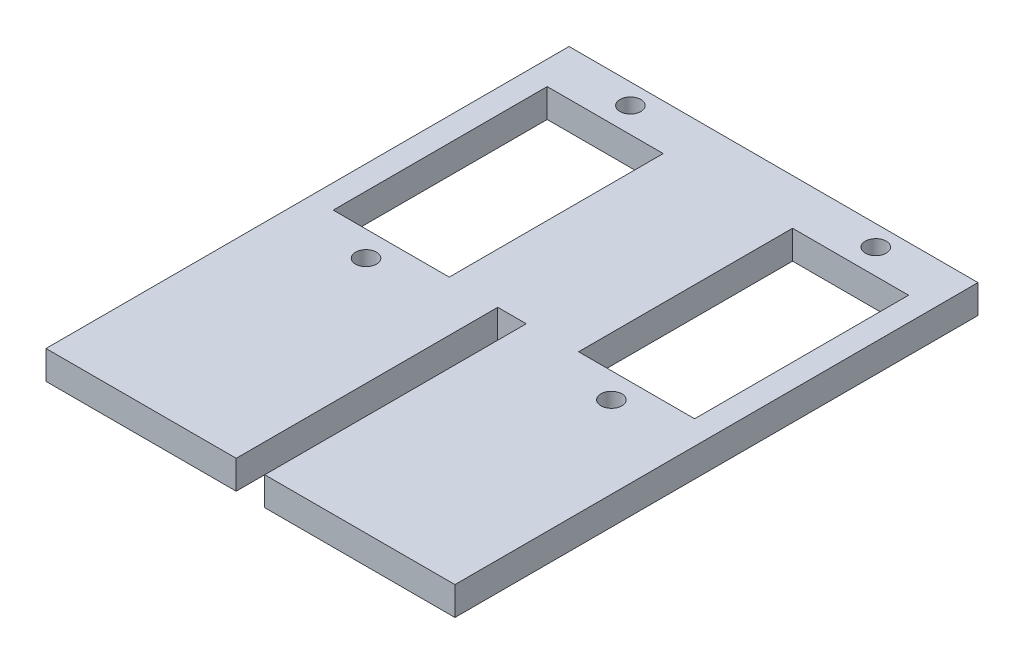
ISO-10303-21;
HEADER;
FILE_DESCRIPTION(('STEP AP214'),'2;1');
FILE_NAME('part.step','',(''),(''),'','','');
FILE_SCHEMA(('AUTOMOTIVE_DESIGN { 1 0 10303 214 1 1 1 1 }'));
ENDSEC;
DATA;
#1=APPLICATION_CONTEXT('core data for automotive mechanical design processes');
#2=APPLICATION_PROTOCOL_DEFINITION('international standard','automotive_design',2000,#1);
#3=PRODUCT_CONTEXT('',#1,'mechanical');
#4=PRODUCT('Part','Part','',(#3));
#5=PRODUCT_RELATED_PRODUCT_CATEGORY('part','',(#4));
#6=PRODUCT_DEFINITION_FORMATION('','',#4);
#7=PRODUCT_DEFINITION_CONTEXT('part definition',#1,'design');
#8=PRODUCT_DEFINITION('design','',#6,#7);
#9=PRODUCT_DEFINITION_SHAPE('','',#8);
#10=(LENGTH_UNIT() NAMED_UNIT(*) SI_UNIT(.MILLI.,.METRE.));
#11=(NAMED_UNIT(*) PLANE_ANGLE_UNIT() SI_UNIT($,.RADIAN.));
#12=(NAMED_UNIT(*) SI_UNIT($,.STERADIAN.) SOLID_ANGLE_UNIT());
#13=UNCERTAINTY_MEASURE_WITH_UNIT(LENGTH_MEASURE(1.E-05),#10,'distance_accuracy_value','');
#14=(GEOMETRIC_REPRESENTATION_CONTEXT(3) GLOBAL_UNCERTAINTY_ASSIGNED_CONTEXT((#13)) GLOBAL_UNIT_ASSIGNED_CONTEXT((#10,
#11,#12)) REPRESENTATION_CONTEXT('',''));
#15=CARTESIAN_POINT('',(0.,0.,0.));
#16=DIRECTION('',(0.,0.,1.));
#17=DIRECTION('',(1.,0.,0.));
#18=AXIS2_PLACEMENT_3D('',#15,#16,#17);
#19=CARTESIAN_POINT('',(-21.5,3.,27.5));
#20=DIRECTION('',(0.,0.,-1.));
#21=DIRECTION('',(-1.,0.,0.));
#22=AXIS2_PLACEMENT_3D('',#19,#20,#21);
#23=PLANE('',#22);
#24=DIRECTION('',(1.,0.,0.));
#25=VECTOR('',#24,1.);
#26=CARTESIAN_POINT('',(-21.5,0.,27.5));
#27=LINE('',#26,#25);
#28=CARTESIAN_POINT('',(-21.5,0.,27.5));
#29=VERTEX_POINT('',#28);
#30=CARTESIAN_POINT('',(-1.5,0.,27.5));
#31=VERTEX_POINT('',#30);
#32=EDGE_CURVE('E253',#29,#31,#27,.T.);
#33=ORIENTED_EDGE('',*,*,#32,.T.);
#34=DIRECTION('',(0.,1.,0.));
#35=VECTOR('',#34,1.);
#36=CARTESIAN_POINT('',(-1.5,-7.,27.5));
#37=LINE('',#36,#35);
#38=CARTESIAN_POINT('',(-1.5,3.,27.5));
#39=VERTEX_POINT('',#38);
#40=EDGE_CURVE('E239',#31,#39,#37,.T.);
#41=ORIENTED_EDGE('',*,*,#40,.T.);
#42=DIRECTION('',(1.,0.,0.));
#43=VECTOR('',#42,1.);
#44=CARTESIAN_POINT('',(-21.5,3.,27.5));
#45=LINE('',#44,#43);
#46=CARTESIAN_POINT('',(-21.5,3.,27.5));
#47=VERTEX_POINT('',#46);
#48=EDGE_CURVE('E258',#47,#39,#45,.T.);
#49=ORIENTED_EDGE('',*,*,#48,.F.);
#50=DIRECTION('',(0.,-1.,0.));
#51=VECTOR('',#50,1.);
#52=CARTESIAN_POINT('',(-21.5,3.,27.5));
#53=LINE('',#52,#51);
#54=EDGE_CURVE('E273',#47,#29,#53,.T.);
#55=ORIENTED_EDGE('',*,*,#54,.T.);
#56=EDGE_LOOP('',(#33,#41,#49,#55));
#57=FACE_BOUND('',#56,.T.);
#58=ADVANCED_FACE('F33',(#57),#23,.F.);
#59=CARTESIAN_POINT('',(21.5,3.,27.5));
#60=DIRECTION('',(-1.,0.,0.));
#61=DIRECTION('',(0.,0.,1.));
#62=AXIS2_PLACEMENT_3D('',#59,#60,#61);
#63=PLANE('',#62);
#64=DIRECTION('',(0.,0.,-1.));
#65=VECTOR('',#64,1.);
#66=CARTESIAN_POINT('',(21.5,0.,27.5));
#67=LINE('',#66,#65);
#68=CARTESIAN_POINT('',(21.5,0.,27.5));
#69=VERTEX_POINT('',#68);
#70=CARTESIAN_POINT('',(21.5,0.,-27.5));
#71=VERTEX_POINT('',#70);
#72=EDGE_CURVE('E242',#69,#71,#67,.T.);
#73=ORIENTED_EDGE('',*,*,#72,.T.);
#74=DIRECTION('',(0.,-1.,0.));
#75=VECTOR('',#74,1.);
#76=CARTESIAN_POINT('',(21.5,3.,-27.5));
#77=LINE('',#76,#75);
#78=CARTESIAN_POINT('',(21.5,3.,-27.5));
#79=VERTEX_POINT('',#78);
#80=EDGE_CURVE('E279',#79,#71,#77,.T.);
#81=ORIENTED_EDGE('',*,*,#80,.F.);
#82=DIRECTION('',(0.,0.,-1.));
#83=VECTOR('',#82,1.);
#84=CARTESIAN_POINT('',(21.5,3.,27.5));
#85=LINE('',#84,#83);
#86=CARTESIAN_POINT('',(21.5,3.,27.5));
#87=VERTEX_POINT('',#86);
#88=EDGE_CURVE('E249',#87,#79,#85,.T.);
#89=ORIENTED_EDGE('',*,*,#88,.F.);
#90=DIRECTION('',(0.,-1.,0.));
#91=VECTOR('',#90,1.);
#92=CARTESIAN_POINT('',(21.5,3.,27.5));
#93=LINE('',#92,#91);
#94=EDGE_CURVE('E261',#87,#69,#93,.T.);
#95=ORIENTED_EDGE('',*,*,#94,.T.);
#96=EDGE_LOOP('',(#73,#81,#89,#95));
#97=FACE_BOUND('',#96,.T.);
#98=ADVANCED_FACE('F35',(#97),#63,.F.);
#99=CARTESIAN_POINT('',(-21.5,3.,-27.5));
#100=DIRECTION('',(0.,0.,1.));
#101=DIRECTION('',(1.,0.,0.));
#102=AXIS2_PLACEMENT_3D('',#99,#100,#101);
#103=PLANE('',#102);
#104=DIRECTION('',(-1.,0.,0.));
#105=VECTOR('',#104,1.);
#106=CARTESIAN_POINT('',(-21.5,0.,-27.5));
#107=LINE('',#106,#105);
#108=CARTESIAN_POINT('',(-21.5,0.,-27.5));
#109=VERTEX_POINT('',#108);
#110=EDGE_CURVE('E264',#71,#109,#107,.T.);
#111=ORIENTED_EDGE('',*,*,#110,.T.);
#112=DIRECTION('',(0.,-1.,0.));
#113=VECTOR('',#112,1.);
#114=CARTESIAN_POINT('',(-21.5,3.,-27.5));
#115=LINE('',#114,#113);
#116=CARTESIAN_POINT('',(-21.5,3.,-27.5));
#117=VERTEX_POINT('',#116);
#118=EDGE_CURVE('E276',#117,#109,#115,.T.);
#119=ORIENTED_EDGE('',*,*,#118,.F.);
#120=DIRECTION('',(-1.,0.,0.));
#121=VECTOR('',#120,1.);
#122=CARTESIAN_POINT('',(-21.5,3.,-27.5));
#123=LINE('',#122,#121);
#124=EDGE_CURVE('E252',#79,#117,#123,.T.);
#125=ORIENTED_EDGE('',*,*,#124,.F.);
#126=ORIENTED_EDGE('',*,*,#80,.T.);
#127=EDGE_LOOP('',(#111,#119,#125,#126));
#128=FACE_BOUND('',#127,.T.);
#129=ADVANCED_FACE('F319',(#128),#103,.F.);
#130=CARTESIAN_POINT('',(-21.5,3.,27.5));
#131=DIRECTION('',(1.,0.,0.));
#132=DIRECTION('',(0.,0.,-1.));
#133=AXIS2_PLACEMENT_3D('',#130,#131,#132);
#134=PLANE('',#133);
#135=DIRECTION('',(0.,0.,1.));
#136=VECTOR('',#135,1.);
#137=CARTESIAN_POINT('',(-21.5,0.,27.5));
#138=LINE('',#137,#136);
#139=EDGE_CURVE('E266',#109,#29,#138,.T.);
#140=ORIENTED_EDGE('',*,*,#139,.T.);
#141=ORIENTED_EDGE('',*,*,#54,.F.);
#142=DIRECTION('',(0.,0.,1.));
#143=VECTOR('',#142,1.);
#144=CARTESIAN_POINT('',(-21.5,3.,27.5));
#145=LINE('',#144,#143);
#146=EDGE_CURVE('E255',#117,#47,#145,.T.);
#147=ORIENTED_EDGE('',*,*,#146,.F.);
#148=ORIENTED_EDGE('',*,*,#118,.T.);
#149=EDGE_LOOP('',(#140,#141,#147,#148));
#150=FACE_BOUND('',#149,.T.);
#151=ADVANCED_FACE('F315',(#150),#134,.F.);
#152=CARTESIAN_POINT('',(1.5,3.,27.5));
#153=VERTEX_POINT('',#152);
#154=EDGE_CURVE('E257',#153,#87,#45,.T.);
#155=ORIENTED_EDGE('',*,*,#154,.F.);
#156=DIRECTION('',(0.,1.,0.));
#157=VECTOR('',#156,1.);
#158=CARTESIAN_POINT('',(1.5,-7.,27.5));
#159=LINE('',#158,#157);
#160=CARTESIAN_POINT('',(1.5,0.,27.5));
#161=VERTEX_POINT('',#160);
#162=EDGE_CURVE('E245',#161,#153,#159,.T.);
#163=ORIENTED_EDGE('',*,*,#162,.F.);
#164=EDGE_CURVE('E268',#161,#69,#27,.T.);
#165=ORIENTED_EDGE('',*,*,#164,.T.);
#166=ORIENTED_EDGE('',*,*,#94,.F.);
#167=EDGE_LOOP('',(#155,#163,#165,#166));
#168=FACE_BOUND('',#167,.T.);
#169=ADVANCED_FACE('F299',(#168),#23,.F.);
#170=CARTESIAN_POINT('',(0.,3.,0.));
#171=DIRECTION('',(0.,-1.,0.));
#172=DIRECTION('',(0.,0.,-1.));
#173=AXIS2_PLACEMENT_3D('',#170,#171,#172);
#174=PLANE('',#173);
#175=CARTESIAN_POINT('',(-12.8999999999996,3.,-25.3500000000002));
#176=DIRECTION('',(0.,-1.,0.));
#177=DIRECTION('',(0.,0.,-1.));
#178=AXIS2_PLACEMENT_3D('',#175,#176,#177);
#179=CIRCLE('',#178,1.1);
#180=CARTESIAN_POINT('',(-12.8999999999996,3.,-26.4500000000002));
#181=VERTEX_POINT('',#180);
#182=EDGE_CURVE('E228',#181,#181,#179,.T.);
#183=ORIENTED_EDGE('',*,*,#182,.T.);
#184=EDGE_LOOP('',(#183));
#185=FACE_BOUND('',#184,.T.);
#186=CARTESIAN_POINT('',(12.8999999999999,3.,2.44999999999984));
#187=DIRECTION('',(0.,-1.,0.));
#188=DIRECTION('',(0.,0.,-1.));
#189=AXIS2_PLACEMENT_3D('',#186,#187,#188);
#190=CIRCLE('',#189,1.1);
#191=CARTESIAN_POINT('',(12.8999999999999,3.,1.34999999999984));
#192=VERTEX_POINT('',#191);
#193=EDGE_CURVE('E225',#192,#192,#190,.T.);
#194=ORIENTED_EDGE('',*,*,#193,.T.);
#195=EDGE_LOOP('',(#194));
#196=FACE_BOUND('',#195,.T.);
#197=CARTESIAN_POINT('',(12.8999999999996,3.,-25.3500000000002));
#198=DIRECTION('',(0.,-1.,0.));
#199=DIRECTION('',(0.,0.,-1.));
#200=AXIS2_PLACEMENT_3D('',#197,#198,#199);
#201=CIRCLE('',#200,1.1);
#202=CARTESIAN_POINT('',(12.8999999999996,3.,-26.4500000000002));
#203=VERTEX_POINT('',#202);
#204=EDGE_CURVE('E222',#203,#203,#201,.T.);
#205=ORIENTED_EDGE('',*,*,#204,.T.);
#206=EDGE_LOOP('',(#205));
#207=FACE_BOUND('',#206,.T.);
#208=DIRECTION('',(1.,0.,0.));
#209=VECTOR('',#208,1.);
#210=CARTESIAN_POINT('',(0.,3.,-22.7000000000002));
#211=LINE('',#210,#209);
#212=CARTESIAN_POINT('',(-18.9999999999996,3.,-22.7000000000002));
#213=VERTEX_POINT('',#212);
#214=CARTESIAN_POINT('',(-6.79999999999987,3.,-22.7000000000002));
#215=VERTEX_POINT('',#214);
#216=EDGE_CURVE('E216',#213,#215,#211,.T.);
#217=ORIENTED_EDGE('',*,*,#216,.T.);
#218=DIRECTION('',(0.,0.,1.));
#219=VECTOR('',#218,1.);
#220=CARTESIAN_POINT('',(-6.79999999999987,3.,0.));
#221=LINE('',#220,#219);
#222=CARTESIAN_POINT('',(-6.79999999999987,3.,-0.200000000000102));
#223=VERTEX_POINT('',#222);
#224=EDGE_CURVE('E219',#215,#223,#221,.T.);
#225=ORIENTED_EDGE('',*,*,#224,.T.);
#226=DIRECTION('',(-1.,0.,0.));
#227=VECTOR('',#226,1.);
#228=CARTESIAN_POINT('',(0.,3.,-0.200000000000102));
#229=LINE('',#228,#227);
#230=CARTESIAN_POINT('',(-18.9999999999996,3.,-0.200000000000102));
#231=VERTEX_POINT('',#230);
#232=EDGE_CURVE('E213',#223,#231,#229,.T.);
#233=ORIENTED_EDGE('',*,*,#232,.T.);
#234=DIRECTION('',(0.,0.,-1.));
#235=VECTOR('',#234,1.);
#236=CARTESIAN_POINT('',(-18.9999999999996,3.,0.));
#237=LINE('',#236,#235);
#238=EDGE_CURVE('E150',#231,#213,#237,.T.);
#239=ORIENTED_EDGE('',*,*,#238,.T.);
#240=EDGE_LOOP('',(#217,#225,#233,#239));
#241=FACE_BOUND('',#240,.T.);
#242=CARTESIAN_POINT('',(-12.8999999999999,3.,2.44999999999984));
#243=DIRECTION('',(0.,-1.,0.));
#244=DIRECTION('',(0.,0.,-1.));
#245=AXIS2_PLACEMENT_3D('',#242,#243,#244);
#246=CIRCLE('',#245,1.1);
#247=CARTESIAN_POINT('',(-12.8999999999999,3.,1.34999999999984));
#248=VERTEX_POINT('',#247);
#249=EDGE_CURVE('E210',#248,#248,#246,.T.);
#250=ORIENTED_EDGE('',*,*,#249,.T.);
#251=EDGE_LOOP('',(#250));
#252=FACE_BOUND('',#251,.T.);
#253=DIRECTION('',(1.,0.,0.));
#254=VECTOR('',#253,1.);
#255=CARTESIAN_POINT('',(0.,3.,-22.7000000000002));
#256=LINE('',#255,#254);
#257=CARTESIAN_POINT('',(6.79999999999987,3.,-22.7000000000002));
#258=VERTEX_POINT('',#257);
#259=CARTESIAN_POINT('',(18.9999999999996,3.,-22.7000000000002));
#260=VERTEX_POINT('',#259);
#261=EDGE_CURVE('E204',#258,#260,#256,.T.);
#262=ORIENTED_EDGE('',*,*,#261,.T.);
#263=DIRECTION('',(0.,0.,1.));
#264=VECTOR('',#263,1.);
#265=CARTESIAN_POINT('',(18.9999999999996,3.,0.));
#266=LINE('',#265,#264);
#267=CARTESIAN_POINT('',(18.9999999999996,3.,-0.200000000000102));
#268=VERTEX_POINT('',#267);
#269=EDGE_CURVE('E207',#260,#268,#266,.T.);
#270=ORIENTED_EDGE('',*,*,#269,.T.);
#271=DIRECTION('',(-1.,0.,0.));
#272=VECTOR('',#271,1.);
#273=CARTESIAN_POINT('',(0.,3.,-0.200000000000102));
#274=LINE('',#273,#272);
#275=CARTESIAN_POINT('',(6.79999999999987,3.,-0.200000000000102));
#276=VERTEX_POINT('',#275);
#277=EDGE_CURVE('E193',#268,#276,#274,.T.);
#278=ORIENTED_EDGE('',*,*,#277,.T.);
#279=DIRECTION('',(0.,0.,-1.));
#280=VECTOR('',#279,1.);
#281=CARTESIAN_POINT('',(6.79999999999987,3.,0.));
#282=LINE('',#281,#280);
#283=EDGE_CURVE('E201',#276,#258,#282,.T.);
#284=ORIENTED_EDGE('',*,*,#283,.T.);
#285=EDGE_LOOP('',(#262,#270,#278,#284));
#286=FACE_BOUND('',#285,.T.);
#287=ORIENTED_EDGE('',*,*,#48,.T.);
#288=DIRECTION('',(0.,0.,1.));
#289=VECTOR('',#288,1.);
#290=CARTESIAN_POINT('',(-1.5,3.,27.5));
#291=LINE('',#290,#289);
#292=CARTESIAN_POINT('',(-1.5,3.,0.));
#293=VERTEX_POINT('',#292);
#294=EDGE_CURVE('E231',#293,#39,#291,.T.);
#295=ORIENTED_EDGE('',*,*,#294,.F.);
#296=DIRECTION('',(-1.,0.,0.));
#297=VECTOR('',#296,1.);
#298=CARTESIAN_POINT('',(-1.5,3.,0.));
#299=LINE('',#298,#297);
#300=CARTESIAN_POINT('',(1.5,3.,0.));
#301=VERTEX_POINT('',#300);
#302=EDGE_CURVE('E236',#301,#293,#299,.T.);
#303=ORIENTED_EDGE('',*,*,#302,.F.);
#304=DIRECTION('',(0.,0.,-1.));
#305=VECTOR('',#304,1.);
#306=CARTESIAN_POINT('',(1.5,3.,27.5));
#307=LINE('',#306,#305);
#308=EDGE_CURVE('E233',#153,#301,#307,.T.);
#309=ORIENTED_EDGE('',*,*,#308,.F.);
#310=ORIENTED_EDGE('',*,*,#154,.T.);
#311=ORIENTED_EDGE('',*,*,#88,.T.);
#312=ORIENTED_EDGE('',*,*,#124,.T.);
#313=ORIENTED_EDGE('',*,*,#146,.T.);
#314=EDGE_LOOP('',(#287,#295,#303,#309,#310,#311,#312,#313));
#315=FACE_BOUND('',#314,.T.);
#316=ADVANCED_FACE('F303',(#185,#196,#207,#241,#252,#286,#315),#174,.F.);
#317=CARTESIAN_POINT('',(0.,0.,0.));
#318=DIRECTION('',(0.,-1.,0.));
#319=DIRECTION('',(0.,0.,-1.));
#320=AXIS2_PLACEMENT_3D('',#317,#318,#319);
#321=PLANE('',#320);
#322=CARTESIAN_POINT('',(-12.8999999999996,0.,-25.3500000000002));
#323=DIRECTION('',(0.,-1.,0.));
#324=DIRECTION('',(0.,0.,1.));
#325=AXIS2_PLACEMENT_3D('',#322,#323,#324);
#326=CIRCLE('',#325,1.1);
#327=CARTESIAN_POINT('',(-12.8999999999996,0.,-24.2500000000002));
#328=VERTEX_POINT('',#327);
#329=EDGE_CURVE('E516',#328,#328,#326,.T.);
#330=ORIENTED_EDGE('',*,*,#329,.F.);
#331=EDGE_LOOP('',(#330));
#332=FACE_BOUND('',#331,.T.);
#333=CARTESIAN_POINT('',(12.8999999999999,0.,2.44999999999984));
#334=DIRECTION('',(0.,-1.,0.));
#335=DIRECTION('',(0.,0.,-1.));
#336=AXIS2_PLACEMENT_3D('',#333,#334,#335);
#337=CIRCLE('',#336,1.1);
#338=CARTESIAN_POINT('',(12.8999999999999,0.,1.34999999999984));
#339=VERTEX_POINT('',#338);
#340=EDGE_CURVE('E180',#339,#339,#337,.T.);
#341=ORIENTED_EDGE('',*,*,#340,.F.);
#342=EDGE_LOOP('',(#341));
#343=FACE_BOUND('',#342,.T.);
#344=CARTESIAN_POINT('',(12.8999999999996,0.,-25.3500000000002));
#345=DIRECTION('',(0.,-1.,0.));
#346=DIRECTION('',(0.,0.,-1.));
#347=AXIS2_PLACEMENT_3D('',#344,#345,#346);
#348=CIRCLE('',#347,1.1);
#349=CARTESIAN_POINT('',(12.8999999999996,0.,-26.4500000000002));
#350=VERTEX_POINT('',#349);
#351=EDGE_CURVE('E177',#350,#350,#348,.T.);
#352=ORIENTED_EDGE('',*,*,#351,.F.);
#353=EDGE_LOOP('',(#352));
#354=FACE_BOUND('',#353,.T.);
#355=DIRECTION('',(0.,0.,1.));
#356=VECTOR('',#355,1.);
#357=CARTESIAN_POINT('',(-6.79999999999987,0.,-0.200000000000102));
#358=LINE('',#357,#356);
#359=CARTESIAN_POINT('',(-6.79999999999987,0.,-22.7000000000002));
#360=VERTEX_POINT('',#359);
#361=CARTESIAN_POINT('',(-6.79999999999987,0.,-0.200000000000102));
#362=VERTEX_POINT('',#361);
#363=EDGE_CURVE('E162',#360,#362,#358,.T.);
#364=ORIENTED_EDGE('',*,*,#363,.F.);
#365=DIRECTION('',(1.,0.,0.));
#366=VECTOR('',#365,1.);
#367=CARTESIAN_POINT('',(-6.79999999999987,0.,-22.7000000000002));
#368=LINE('',#367,#366);
#369=CARTESIAN_POINT('',(-18.9999999999996,0.,-22.7000000000002));
#370=VERTEX_POINT('',#369);
#371=EDGE_CURVE('E167',#370,#360,#368,.T.);
#372=ORIENTED_EDGE('',*,*,#371,.F.);
#373=DIRECTION('',(0.,0.,-1.));
#374=VECTOR('',#373,1.);
#375=CARTESIAN_POINT('',(-18.9999999999996,0.,-0.200000000000102));
#376=LINE('',#375,#374);
#377=CARTESIAN_POINT('',(-18.9999999999996,0.,-0.200000000000102));
#378=VERTEX_POINT('',#377);
#379=EDGE_CURVE('E147',#378,#370,#376,.T.);
#380=ORIENTED_EDGE('',*,*,#379,.F.);
#381=DIRECTION('',(-1.,0.,0.));
#382=VECTOR('',#381,1.);
#383=CARTESIAN_POINT('',(-6.79999999999987,0.,-0.200000000000102));
#384=LINE('',#383,#382);
#385=EDGE_CURVE('E157',#362,#378,#384,.T.);
#386=ORIENTED_EDGE('',*,*,#385,.F.);
#387=EDGE_LOOP('',(#364,#372,#380,#386));
#388=FACE_BOUND('',#387,.T.);
#389=CARTESIAN_POINT('',(-12.8999999999999,0.,2.44999999999984));
#390=DIRECTION('',(0.,-1.,0.));
#391=DIRECTION('',(0.,0.,1.));
#392=AXIS2_PLACEMENT_3D('',#389,#390,#391);
#393=CIRCLE('',#392,1.1);
#394=CARTESIAN_POINT('',(-12.8999999999999,0.,3.54999999999984));
#395=VERTEX_POINT('',#394);
#396=EDGE_CURVE('E538',#395,#395,#393,.T.);
#397=ORIENTED_EDGE('',*,*,#396,.F.);
#398=EDGE_LOOP('',(#397));
#399=FACE_BOUND('',#398,.T.);
#400=DIRECTION('',(0.,0.,1.));
#401=VECTOR('',#400,1.);
#402=CARTESIAN_POINT('',(18.9999999999996,0.,-0.200000000000102));
#403=LINE('',#402,#401);
#404=CARTESIAN_POINT('',(18.9999999999996,0.,-22.7000000000002));
#405=VERTEX_POINT('',#404);
#406=CARTESIAN_POINT('',(18.9999999999996,0.,-0.200000000000102));
#407=VERTEX_POINT('',#406);
#408=EDGE_CURVE('E174',#405,#407,#403,.T.);
#409=ORIENTED_EDGE('',*,*,#408,.F.);
#410=DIRECTION('',(1.,0.,0.));
#411=VECTOR('',#410,1.);
#412=CARTESIAN_POINT('',(6.79999999999987,0.,-22.7000000000002));
#413=LINE('',#412,#411);
#414=CARTESIAN_POINT('',(6.79999999999987,0.,-22.7000000000002));
#415=VERTEX_POINT('',#414);
#416=EDGE_CURVE('E187',#415,#405,#413,.T.);
#417=ORIENTED_EDGE('',*,*,#416,.F.);
#418=DIRECTION('',(0.,0.,-1.));
#419=VECTOR('',#418,1.);
#420=CARTESIAN_POINT('',(6.79999999999987,0.,-0.200000000000102));
#421=LINE('',#420,#419);
#422=CARTESIAN_POINT('',(6.79999999999987,0.,-0.200000000000102));
#423=VERTEX_POINT('',#422);
#424=EDGE_CURVE('E184',#423,#415,#421,.T.);
#425=ORIENTED_EDGE('',*,*,#424,.F.);
#426=DIRECTION('',(-1.,0.,0.));
#427=VECTOR('',#426,1.);
#428=CARTESIAN_POINT('',(6.79999999999987,0.,-0.200000000000102));
#429=LINE('',#428,#427);
#430=EDGE_CURVE('E182',#407,#423,#429,.T.);
#431=ORIENTED_EDGE('',*,*,#430,.F.);
#432=EDGE_LOOP('',(#409,#417,#425,#431));
#433=FACE_BOUND('',#432,.T.);
#434=DIRECTION('',(0.,0.,-1.));
#435=VECTOR('',#434,1.);
#436=CARTESIAN_POINT('',(-1.5,0.,0.));
#437=LINE('',#436,#435);
#438=CARTESIAN_POINT('',(-1.5,0.,0.));
#439=VERTEX_POINT('',#438);
#440=EDGE_CURVE('E11',#31,#439,#437,.T.);
#441=ORIENTED_EDGE('',*,*,#440,.F.);
#442=ORIENTED_EDGE('',*,*,#32,.F.);
#443=ORIENTED_EDGE('',*,*,#139,.F.);
#444=ORIENTED_EDGE('',*,*,#110,.F.);
#445=ORIENTED_EDGE('',*,*,#72,.F.);
#446=ORIENTED_EDGE('',*,*,#164,.F.);
#447=DIRECTION('',(0.,0.,1.));
#448=VECTOR('',#447,1.);
#449=CARTESIAN_POINT('',(1.5,0.,0.));
#450=LINE('',#449,#448);
#451=CARTESIAN_POINT('',(1.5,0.,0.));
#452=VERTEX_POINT('',#451);
#453=EDGE_CURVE('E282',#452,#161,#450,.T.);
#454=ORIENTED_EDGE('',*,*,#453,.F.);
#455=DIRECTION('',(1.,0.,0.));
#456=VECTOR('',#455,1.);
#457=CARTESIAN_POINT('',(0.,0.,0.));
#458=LINE('',#457,#456);
#459=EDGE_CURVE('E41',#439,#452,#458,.T.);
#460=ORIENTED_EDGE('',*,*,#459,.F.);
#461=EDGE_LOOP('',(#441,#442,#443,#444,#445,#446,#454,#460));
#462=FACE_BOUND('',#461,.T.);
#463=ADVANCED_FACE('F164',(#332,#343,#354,#388,#399,#433,#462),#321,.T.);
#464=CARTESIAN_POINT('',(-1.5,-7.,27.5));
#465=DIRECTION('',(-1.,0.,0.));
#466=DIRECTION('',(0.,0.,1.));
#467=AXIS2_PLACEMENT_3D('',#464,#465,#466);
#468=PLANE('',#467);
#469=ORIENTED_EDGE('',*,*,#440,.T.);
#470=DIRECTION('',(0.,1.,0.));
#471=VECTOR('',#470,1.);
#472=CARTESIAN_POINT('',(-1.5,-7.,0.));
#473=LINE('',#472,#471);
#474=EDGE_CURVE('E240',#439,#293,#473,.T.);
#475=ORIENTED_EDGE('',*,*,#474,.T.);
#476=ORIENTED_EDGE('',*,*,#294,.T.);
#477=ORIENTED_EDGE('',*,*,#40,.F.);
#478=EDGE_LOOP('',(#469,#475,#476,#477));
#479=FACE_BOUND('',#478,.T.);
#480=ADVANCED_FACE('F309',(#479),#468,.F.);
#481=CARTESIAN_POINT('',(-1.5,-7.,0.));
#482=DIRECTION('',(0.,0.,-1.));
#483=DIRECTION('',(-1.,0.,0.));
#484=AXIS2_PLACEMENT_3D('',#481,#482,#483);
#485=PLANE('',#484);
#486=ORIENTED_EDGE('',*,*,#459,.T.);
#487=DIRECTION('',(0.,1.,0.));
#488=VECTOR('',#487,1.);
#489=CARTESIAN_POINT('',(1.5,-7.,0.));
#490=LINE('',#489,#488);
#491=EDGE_CURVE('E243',#452,#301,#490,.T.);
#492=ORIENTED_EDGE('',*,*,#491,.T.);
#493=ORIENTED_EDGE('',*,*,#302,.T.);
#494=ORIENTED_EDGE('',*,*,#474,.F.);
#495=EDGE_LOOP('',(#486,#492,#493,#494));
#496=FACE_BOUND('',#495,.T.);
#497=ADVANCED_FACE('F288',(#496),#485,.F.);
#498=CARTESIAN_POINT('',(1.5,-7.,27.5));
#499=DIRECTION('',(1.,0.,0.));
#500=DIRECTION('',(0.,0.,-1.));
#501=AXIS2_PLACEMENT_3D('',#498,#499,#500);
#502=PLANE('',#501);
#503=ORIENTED_EDGE('',*,*,#453,.T.);
#504=ORIENTED_EDGE('',*,*,#162,.T.);
#505=ORIENTED_EDGE('',*,*,#308,.T.);
#506=ORIENTED_EDGE('',*,*,#491,.F.);
#507=EDGE_LOOP('',(#503,#504,#505,#506));
#508=FACE_BOUND('',#507,.T.);
#509=ADVANCED_FACE('F295',(#508),#502,.F.);
#510=CARTESIAN_POINT('',(18.9999999999996,10.,-0.200000000000102));
#511=DIRECTION('',(1.,0.,0.));
#512=DIRECTION('',(0.,0.,-1.));
#513=AXIS2_PLACEMENT_3D('',#510,#511,#512);
#514=PLANE('',#513);
#515=DIRECTION('',(0.,-1.,0.));
#516=VECTOR('',#515,1.);
#517=CARTESIAN_POINT('',(18.9999999999996,10.,-22.7000000000002));
#518=LINE('',#517,#516);
#519=EDGE_CURVE('E191',#260,#405,#518,.T.);
#520=ORIENTED_EDGE('',*,*,#519,.T.);
#521=ORIENTED_EDGE('',*,*,#408,.T.);
#522=DIRECTION('',(0.,-1.,0.));
#523=VECTOR('',#522,1.);
#524=CARTESIAN_POINT('',(18.9999999999996,10.,-0.200000000000102));
#525=LINE('',#524,#523);
#526=EDGE_CURVE('E190',#268,#407,#525,.T.);
#527=ORIENTED_EDGE('',*,*,#526,.F.);
#528=ORIENTED_EDGE('',*,*,#269,.F.);
#529=EDGE_LOOP('',(#520,#521,#527,#528));
#530=FACE_BOUND('',#529,.T.);
#531=ADVANCED_FACE('F394',(#530),#514,.F.);
#532=CARTESIAN_POINT('',(6.79999999999987,10.,-22.7000000000002));
#533=DIRECTION('',(0.,0.,-1.));
#534=DIRECTION('',(-1.,0.,0.));
#535=AXIS2_PLACEMENT_3D('',#532,#533,#534);
#536=PLANE('',#535);
#537=DIRECTION('',(0.,-1.,0.));
#538=VECTOR('',#537,1.);
#539=CARTESIAN_POINT('',(6.79999999999987,10.,-22.7000000000002));
#540=LINE('',#539,#538);
#541=EDGE_CURVE('E194',#258,#415,#540,.T.);
#542=ORIENTED_EDGE('',*,*,#541,.T.);
#543=ORIENTED_EDGE('',*,*,#416,.T.);
#544=ORIENTED_EDGE('',*,*,#519,.F.);
#545=ORIENTED_EDGE('',*,*,#261,.F.);
#546=EDGE_LOOP('',(#542,#543,#544,#545));
#547=FACE_BOUND('',#546,.T.);
#548=ADVANCED_FACE('F402',(#547),#536,.F.);
#549=CARTESIAN_POINT('',(6.79999999999987,10.,-0.200000000000102));
#550=DIRECTION('',(-1.,0.,0.));
#551=DIRECTION('',(0.,0.,1.));
#552=AXIS2_PLACEMENT_3D('',#549,#550,#551);
#553=PLANE('',#552);
#554=DIRECTION('',(0.,-1.,0.));
#555=VECTOR('',#554,1.);
#556=CARTESIAN_POINT('',(6.79999999999987,10.,-0.200000000000102));
#557=LINE('',#556,#555);
#558=EDGE_CURVE('E56',#276,#423,#557,.T.);
#559=ORIENTED_EDGE('',*,*,#558,.T.);
#560=ORIENTED_EDGE('',*,*,#424,.T.);
#561=ORIENTED_EDGE('',*,*,#541,.F.);
#562=ORIENTED_EDGE('',*,*,#283,.F.);
#563=EDGE_LOOP('',(#559,#560,#561,#562));
#564=FACE_BOUND('',#563,.T.);
#565=ADVANCED_FACE('F411',(#564),#553,.F.);
#566=CARTESIAN_POINT('',(6.79999999999987,10.,-0.200000000000102));
#567=DIRECTION('',(0.,0.,1.));
#568=DIRECTION('',(1.,0.,0.));
#569=AXIS2_PLACEMENT_3D('',#566,#567,#568);
#570=PLANE('',#569);
#571=ORIENTED_EDGE('',*,*,#526,.T.);
#572=ORIENTED_EDGE('',*,*,#430,.T.);
#573=ORIENTED_EDGE('',*,*,#558,.F.);
#574=ORIENTED_EDGE('',*,*,#277,.F.);
#575=EDGE_LOOP('',(#571,#572,#573,#574));
#576=FACE_BOUND('',#575,.T.);
#577=ADVANCED_FACE('F420',(#576),#570,.F.);
#578=CARTESIAN_POINT('',(-12.8999999999999,10.,2.44999999999984));
#579=DIRECTION('',(0.,-1.,0.));
#580=DIRECTION('',(0.,0.,-1.));
#581=AXIS2_PLACEMENT_3D('',#578,#579,#580);
#582=CYLINDRICAL_SURFACE('',#581,1.1);
#583=ORIENTED_EDGE('',*,*,#396,.T.);
#584=EDGE_LOOP('',(#583));
#585=FACE_BOUND('',#584,.T.);
#586=ORIENTED_EDGE('',*,*,#249,.F.);
#587=EDGE_LOOP('',(#586));
#588=FACE_BOUND('',#587,.T.);
#589=ADVANCED_FACE('F429',(#585,#588),#582,.F.);
#590=CARTESIAN_POINT('',(-6.79999999999987,10.,-0.200000000000102));
#591=DIRECTION('',(1.,0.,0.));
#592=DIRECTION('',(0.,0.,-1.));
#593=AXIS2_PLACEMENT_3D('',#590,#591,#592);
#594=PLANE('',#593);
#595=DIRECTION('',(0.,-1.,0.));
#596=VECTOR('',#595,1.);
#597=CARTESIAN_POINT('',(-6.79999999999987,10.,-22.7000000000002));
#598=LINE('',#597,#596);
#599=EDGE_CURVE('E172',#215,#360,#598,.T.);
#600=ORIENTED_EDGE('',*,*,#599,.T.);
#601=ORIENTED_EDGE('',*,*,#363,.T.);
#602=DIRECTION('',(0.,-1.,0.));
#603=VECTOR('',#602,1.);
#604=CARTESIAN_POINT('',(-6.79999999999987,10.,-0.200000000000102));
#605=LINE('',#604,#603);
#606=EDGE_CURVE('E153',#223,#362,#605,.T.);
#607=ORIENTED_EDGE('',*,*,#606,.F.);
#608=ORIENTED_EDGE('',*,*,#224,.F.);
#609=EDGE_LOOP('',(#600,#601,#607,#608));
#610=FACE_BOUND('',#609,.T.);
#611=ADVANCED_FACE('F437',(#610),#594,.F.);
#612=CARTESIAN_POINT('',(-6.79999999999987,10.,-22.7000000000002));
#613=DIRECTION('',(0.,0.,-1.));
#614=DIRECTION('',(-1.,0.,0.));
#615=AXIS2_PLACEMENT_3D('',#612,#613,#614);
#616=PLANE('',#615);
#617=DIRECTION('',(0.,-1.,0.));
#618=VECTOR('',#617,1.);
#619=CARTESIAN_POINT('',(-18.9999999999996,10.,-22.7000000000002));
#620=LINE('',#619,#618);
#621=EDGE_CURVE('E152',#213,#370,#620,.T.);
#622=ORIENTED_EDGE('',*,*,#621,.T.);
#623=ORIENTED_EDGE('',*,*,#371,.T.);
#624=ORIENTED_EDGE('',*,*,#599,.F.);
#625=ORIENTED_EDGE('',*,*,#216,.F.);
#626=EDGE_LOOP('',(#622,#623,#624,#625));
#627=FACE_BOUND('',#626,.T.);
#628=ADVANCED_FACE('F446',(#627),#616,.F.);
#629=CARTESIAN_POINT('',(-18.9999999999996,10.,-0.200000000000102));
#630=DIRECTION('',(-1.,0.,0.));
#631=DIRECTION('',(0.,0.,1.));
#632=AXIS2_PLACEMENT_3D('',#629,#630,#631);
#633=PLANE('',#632);
#634=DIRECTION('',(0.,-1.,0.));
#635=VECTOR('',#634,1.);
#636=CARTESIAN_POINT('',(-18.9999999999996,10.,-0.200000000000102));
#637=LINE('',#636,#635);
#638=EDGE_CURVE('E48',#231,#378,#637,.T.);
#639=ORIENTED_EDGE('',*,*,#638,.T.);
#640=ORIENTED_EDGE('',*,*,#379,.T.);
#641=ORIENTED_EDGE('',*,*,#621,.F.);
#642=ORIENTED_EDGE('',*,*,#238,.F.);
#643=EDGE_LOOP('',(#639,#640,#641,#642));
#644=FACE_BOUND('',#643,.T.);
#645=ADVANCED_FACE('F144',(#644),#633,.F.);
#646=CARTESIAN_POINT('',(-6.79999999999987,10.,-0.200000000000102));
#647=DIRECTION('',(0.,0.,1.));
#648=DIRECTION('',(1.,0.,0.));
#649=AXIS2_PLACEMENT_3D('',#646,#647,#648);
#650=PLANE('',#649);
#651=ORIENTED_EDGE('',*,*,#606,.T.);
#652=ORIENTED_EDGE('',*,*,#385,.T.);
#653=ORIENTED_EDGE('',*,*,#638,.F.);
#654=ORIENTED_EDGE('',*,*,#232,.F.);
#655=EDGE_LOOP('',(#651,#652,#653,#654));
#656=FACE_BOUND('',#655,.T.);
#657=ADVANCED_FACE('F158',(#656),#650,.F.);
#658=CARTESIAN_POINT('',(12.8999999999996,10.,-25.3500000000002));
#659=DIRECTION('',(0.,-1.,0.));
#660=DIRECTION('',(0.,0.,-1.));
#661=AXIS2_PLACEMENT_3D('',#658,#659,#660);
#662=CYLINDRICAL_SURFACE('',#661,1.1);
#663=ORIENTED_EDGE('',*,*,#351,.T.);
#664=EDGE_LOOP('',(#663));
#665=FACE_BOUND('',#664,.T.);
#666=ORIENTED_EDGE('',*,*,#204,.F.);
#667=EDGE_LOOP('',(#666));
#668=FACE_BOUND('',#667,.T.);
#669=ADVANCED_FACE('F470',(#665,#668),#662,.F.);
#670=CARTESIAN_POINT('',(12.8999999999999,10.,2.44999999999984));
#671=DIRECTION('',(0.,-1.,0.));
#672=DIRECTION('',(0.,0.,-1.));
#673=AXIS2_PLACEMENT_3D('',#670,#671,#672);
#674=CYLINDRICAL_SURFACE('',#673,1.1);
#675=ORIENTED_EDGE('',*,*,#340,.T.);
#676=EDGE_LOOP('',(#675));
#677=FACE_BOUND('',#676,.T.);
#678=ORIENTED_EDGE('',*,*,#193,.F.);
#679=EDGE_LOOP('',(#678));
#680=FACE_BOUND('',#679,.T.);
#681=ADVANCED_FACE('F478',(#677,#680),#674,.F.);
#682=CARTESIAN_POINT('',(-12.8999999999996,10.,-25.3500000000002));
#683=DIRECTION('',(0.,-1.,0.));
#684=DIRECTION('',(0.,0.,-1.));
#685=AXIS2_PLACEMENT_3D('',#682,#683,#684);
#686=CYLINDRICAL_SURFACE('',#685,1.1);
#687=ORIENTED_EDGE('',*,*,#329,.T.);
#688=EDGE_LOOP('',(#687));
#689=FACE_BOUND('',#688,.T.);
#690=ORIENTED_EDGE('',*,*,#182,.F.);
#691=EDGE_LOOP('',(#690));
#692=FACE_BOUND('',#691,.T.);
#693=ADVANCED_FACE('F487',(#689,#692),#686,.F.);
#694=CLOSED_SHELL('',(#58,#98,#129,#151,#169,#316,#463,#480,#497,#509,#531,#548,#565,#577,#589,
#611,#628,#645,#657,#669,#681,#693));
#695=MANIFOLD_SOLID_BREP('B2',#694);
#696=ADVANCED_BREP_SHAPE_REPRESENTATION('',(#18,#695),#14);
#697=SHAPE_DEFINITION_REPRESENTATION(#9,#696);
ENDSEC;
END-ISO-10303-21;
